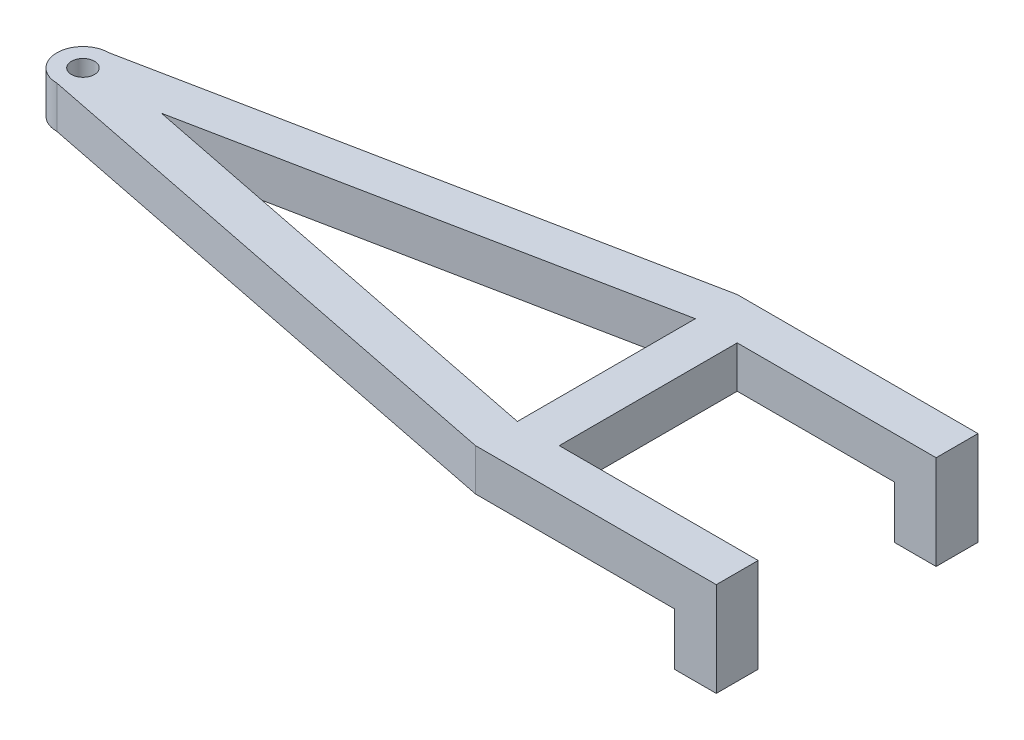
ISO-10303-21;
HEADER;
FILE_DESCRIPTION(('STEP AP214'),'2;1');
FILE_NAME('part.step','',(''),(''),'','','');
FILE_SCHEMA(('AUTOMOTIVE_DESIGN { 1 0 10303 214 1 1 1 1 }'));
ENDSEC;
DATA;
#1=APPLICATION_CONTEXT('core data for automotive mechanical design processes');
#2=APPLICATION_PROTOCOL_DEFINITION('international standard','automotive_design',2000,#1);
#3=PRODUCT_CONTEXT('',#1,'mechanical');
#4=PRODUCT('Part','Part','',(#3));
#5=PRODUCT_RELATED_PRODUCT_CATEGORY('part','',(#4));
#6=PRODUCT_DEFINITION_FORMATION('','',#4);
#7=PRODUCT_DEFINITION_CONTEXT('part definition',#1,'design');
#8=PRODUCT_DEFINITION('design','',#6,#7);
#9=PRODUCT_DEFINITION_SHAPE('','',#8);
#10=(LENGTH_UNIT() NAMED_UNIT(*) SI_UNIT(.MILLI.,.METRE.));
#11=(NAMED_UNIT(*) PLANE_ANGLE_UNIT() SI_UNIT($,.RADIAN.));
#12=(NAMED_UNIT(*) SI_UNIT($,.STERADIAN.) SOLID_ANGLE_UNIT());
#13=UNCERTAINTY_MEASURE_WITH_UNIT(LENGTH_MEASURE(1.E-05),#10,'distance_accuracy_value','');
#14=(GEOMETRIC_REPRESENTATION_CONTEXT(3) GLOBAL_UNCERTAINTY_ASSIGNED_CONTEXT((#13)) GLOBAL_UNIT_ASSIGNED_CONTEXT((#10,
#11,#12)) REPRESENTATION_CONTEXT('',''));
#15=CARTESIAN_POINT('',(0.,0.,0.));
#16=DIRECTION('',(0.,0.,1.));
#17=DIRECTION('',(1.,0.,0.));
#18=AXIS2_PLACEMENT_3D('',#15,#16,#17);
#19=CARTESIAN_POINT('',(0.,0.,0.));
#20=DIRECTION('',(0.,1.,0.));
#21=DIRECTION('',(0.,0.,1.));
#22=AXIS2_PLACEMENT_3D('',#19,#20,#21);
#23=PLANE('',#22);
#24=DIRECTION('',(0.98058067569092,0.,0.196116135138184));
#25=VECTOR('',#24,1.);
#26=CARTESIAN_POINT('',(6.83737044241701,0.,-34.186852212085));
#27=LINE('',#26,#25);
#28=CARTESIAN_POINT('',(-26.7397991567624,0.,-40.9022861319209));
#29=VERTEX_POINT('',#28);
#30=CARTESIAN_POINT('',(15.7602008432377,0.,-32.4022861319209));
#31=VERTEX_POINT('',#30);
#32=EDGE_CURVE('E210',#29,#31,#27,.T.);
#33=ORIENTED_EDGE('',*,*,#32,.T.);
#34=DIRECTION('',(0.,0.,1.));
#35=VECTOR('',#34,1.);
#36=CARTESIAN_POINT('',(15.7602008432377,0.,0.));
#37=LINE('',#36,#35);
#38=CARTESIAN_POINT('',(15.7602008432377,0.,-49.4022861319209));
#39=VERTEX_POINT('',#38);
#40=EDGE_CURVE('E278',#39,#31,#37,.T.);
#41=ORIENTED_EDGE('',*,*,#40,.F.);
#42=DIRECTION('',(0.98058067569092,0.,-0.196116135138184));
#43=VECTOR('',#42,1.);
#44=CARTESIAN_POINT('',(-8.89427806986027,0.,-44.4713903493013));
#45=LINE('',#44,#43);
#46=EDGE_CURVE('E215',#29,#39,#45,.T.);
#47=ORIENTED_EDGE('',*,*,#46,.F.);
#48=EDGE_LOOP('',(#33,#41,#47));
#49=FACE_BOUND('',#48,.T.);
#50=CARTESIAN_POINT('',(-34.2397991567623,0.,-40.9022861319209));
#51=DIRECTION('',(0.,1.,0.));
#52=DIRECTION('',(0.,0.,1.));
#53=AXIS2_PLACEMENT_3D('',#50,#51,#52);
#54=CIRCLE('',#53,1.1);
#55=CARTESIAN_POINT('',(-34.2397991567623,0.,-39.8022861319209));
#56=VERTEX_POINT('',#55);
#57=EDGE_CURVE('E237',#56,#56,#54,.T.);
#58=ORIENTED_EDGE('',*,*,#57,.T.);
#59=EDGE_LOOP('',(#58));
#60=FACE_BOUND('',#59,.T.);
#61=DIRECTION('',(0.,0.,-1.));
#62=VECTOR('',#61,1.);
#63=CARTESIAN_POINT('',(34.7602008432377,0.,-49.4022861319209));
#64=LINE('',#63,#62);
#65=CARTESIAN_POINT('',(34.7602008432377,0.,-49.4022861319209));
#66=VERTEX_POINT('',#65);
#67=CARTESIAN_POINT('',(34.7602008432377,0.,-53.4022861319209));
#68=VERTEX_POINT('',#67);
#69=EDGE_CURVE('E52',#66,#68,#64,.T.);
#70=ORIENTED_EDGE('',*,*,#69,.F.);
#71=DIRECTION('',(1.,0.,0.));
#72=VECTOR('',#71,1.);
#73=CARTESIAN_POINT('',(0.,0.,-49.4022861319209));
#74=LINE('',#73,#72);
#75=CARTESIAN_POINT('',(19.7602008432377,0.,-49.4022861319209));
#76=VERTEX_POINT('',#75);
#77=EDGE_CURVE('E234',#76,#66,#74,.T.);
#78=ORIENTED_EDGE('',*,*,#77,.F.);
#79=DIRECTION('',(0.,0.,1.));
#80=VECTOR('',#79,1.);
#81=CARTESIAN_POINT('',(19.7602008432377,0.,0.));
#82=LINE('',#81,#80);
#83=CARTESIAN_POINT('',(19.7602008432377,0.,-32.4022861319209));
#84=VERTEX_POINT('',#83);
#85=EDGE_CURVE('E231',#76,#84,#82,.T.);
#86=ORIENTED_EDGE('',*,*,#85,.T.);
#87=DIRECTION('',(1.,0.,0.));
#88=VECTOR('',#87,1.);
#89=CARTESIAN_POINT('',(0.,0.,-32.4022861319209));
#90=LINE('',#89,#88);
#91=CARTESIAN_POINT('',(34.7602008432377,0.,-32.4022861319209));
#92=VERTEX_POINT('',#91);
#93=EDGE_CURVE('E222',#84,#92,#90,.T.);
#94=ORIENTED_EDGE('',*,*,#93,.T.);
#95=DIRECTION('',(0.,0.,-1.));
#96=VECTOR('',#95,1.);
#97=CARTESIAN_POINT('',(34.7602008432377,0.,-28.4022861319209));
#98=LINE('',#97,#96);
#99=CARTESIAN_POINT('',(34.7602008432377,0.,-28.4022861319209));
#100=VERTEX_POINT('',#99);
#101=EDGE_CURVE('E177',#100,#92,#98,.T.);
#102=ORIENTED_EDGE('',*,*,#101,.F.);
#103=DIRECTION('',(1.,0.,0.));
#104=VECTOR('',#103,1.);
#105=CARTESIAN_POINT('',(0.,0.,-28.4022861319209));
#106=LINE('',#105,#104);
#107=CARTESIAN_POINT('',(15.7602008432377,0.,-28.4022861319209));
#108=VERTEX_POINT('',#107);
#109=EDGE_CURVE('E218',#108,#100,#106,.T.);
#110=ORIENTED_EDGE('',*,*,#109,.F.);
#111=DIRECTION('',(0.98058067569092,0.,0.196116135138184));
#112=VECTOR('',#111,1.);
#113=CARTESIAN_POINT('',(6.06813967318624,0.,-30.3406983659312));
#114=LINE('',#113,#112);
#115=CARTESIAN_POINT('',(-34.2397991567623,0.,-38.4022861319209));
#116=VERTEX_POINT('',#115);
#117=EDGE_CURVE('E223',#116,#108,#114,.T.);
#118=ORIENTED_EDGE('',*,*,#117,.F.);
#119=CARTESIAN_POINT('',(-34.2397991567623,0.,-40.9022861319209));
#120=DIRECTION('',(0.,1.,0.));
#121=DIRECTION('',(0.,0.,1.));
#122=AXIS2_PLACEMENT_3D('',#119,#120,#121);
#123=CIRCLE('',#122,2.5);
#124=CARTESIAN_POINT('',(-34.2397991567623,0.,-43.4022861319209));
#125=VERTEX_POINT('',#124);
#126=EDGE_CURVE('E286',#125,#116,#123,.T.);
#127=ORIENTED_EDGE('',*,*,#126,.F.);
#128=DIRECTION('',(0.98058067569092,0.,-0.196116135138184));
#129=VECTOR('',#128,1.);
#130=CARTESIAN_POINT('',(-9.66350883909104,0.,-48.3175441954552));
#131=LINE('',#130,#129);
#132=CARTESIAN_POINT('',(15.7602008432377,0.,-53.4022861319209));
#133=VERTEX_POINT('',#132);
#134=EDGE_CURVE('E284',#125,#133,#131,.T.);
#135=ORIENTED_EDGE('',*,*,#134,.T.);
#136=DIRECTION('',(1.,0.,0.));
#137=VECTOR('',#136,1.);
#138=CARTESIAN_POINT('',(0.,0.,-53.402286131921));
#139=LINE('',#138,#137);
#140=EDGE_CURVE('E57',#133,#68,#139,.T.);
#141=ORIENTED_EDGE('',*,*,#140,.T.);
#142=EDGE_LOOP('',(#70,#78,#86,#94,#102,#110,#118,#127,#135,#141));
#143=FACE_BOUND('',#142,.T.);
#144=ADVANCED_FACE('F35',(#49,#60,#143),#23,.F.);
#145=CARTESIAN_POINT('',(-9.66350883909104,4.,-48.3175441954552));
#146=DIRECTION('',(-0.196116135138184,0.,-0.98058067569092));
#147=DIRECTION('',(-0.98058067569092,0.,0.196116135138184));
#148=AXIS2_PLACEMENT_3D('',#145,#146,#147);
#149=PLANE('',#148);
#150=ORIENTED_EDGE('',*,*,#134,.F.);
#151=DIRECTION('',(0.,-1.,0.));
#152=VECTOR('',#151,1.);
#153=CARTESIAN_POINT('',(-34.2397991567623,4.,-43.4022861319209));
#154=LINE('',#153,#152);
#155=CARTESIAN_POINT('',(-34.2397991567623,4.,-43.4022861319209));
#156=VERTEX_POINT('',#155);
#157=EDGE_CURVE('E11',#156,#125,#154,.T.);
#158=ORIENTED_EDGE('',*,*,#157,.F.);
#159=DIRECTION('',(0.98058067569092,0.,-0.196116135138184));
#160=VECTOR('',#159,1.);
#161=CARTESIAN_POINT('',(-9.66350883909104,4.,-48.3175441954552));
#162=LINE('',#161,#160);
#163=CARTESIAN_POINT('',(15.7602008432377,4.,-53.4022861319209));
#164=VERTEX_POINT('',#163);
#165=EDGE_CURVE('E316',#156,#164,#162,.T.);
#166=ORIENTED_EDGE('',*,*,#165,.T.);
#167=DIRECTION('',(0.,-1.,0.));
#168=VECTOR('',#167,1.);
#169=CARTESIAN_POINT('',(15.7602008432377,4.,-53.4022861319209));
#170=LINE('',#169,#168);
#171=EDGE_CURVE('E240',#164,#133,#170,.T.);
#172=ORIENTED_EDGE('',*,*,#171,.T.);
#173=EDGE_LOOP('',(#150,#158,#166,#172));
#174=FACE_BOUND('',#173,.T.);
#175=ADVANCED_FACE('F352',(#174),#149,.T.);
#176=CARTESIAN_POINT('',(-34.2397991567623,4.,-40.9022861319209));
#177=DIRECTION('',(0.,-1.,0.));
#178=DIRECTION('',(0.,0.,-1.));
#179=AXIS2_PLACEMENT_3D('',#176,#177,#178);
#180=CYLINDRICAL_SURFACE('',#179,2.5);
#181=ORIENTED_EDGE('',*,*,#126,.T.);
#182=DIRECTION('',(0.,-1.,0.));
#183=VECTOR('',#182,1.);
#184=CARTESIAN_POINT('',(-34.2397991567623,4.,-38.4022861319209));
#185=LINE('',#184,#183);
#186=CARTESIAN_POINT('',(-34.2397991567623,4.,-38.4022861319209));
#187=VERTEX_POINT('',#186);
#188=EDGE_CURVE('E44',#187,#116,#185,.T.);
#189=ORIENTED_EDGE('',*,*,#188,.F.);
#190=CARTESIAN_POINT('',(-34.2397991567623,4.,-40.9022861319209));
#191=DIRECTION('',(0.,1.,0.));
#192=DIRECTION('',(0.,0.,1.));
#193=AXIS2_PLACEMENT_3D('',#190,#191,#192);
#194=CIRCLE('',#193,2.5);
#195=EDGE_CURVE('E314',#156,#187,#194,.T.);
#196=ORIENTED_EDGE('',*,*,#195,.F.);
#197=ORIENTED_EDGE('',*,*,#157,.T.);
#198=EDGE_LOOP('',(#181,#189,#196,#197));
#199=FACE_BOUND('',#198,.T.);
#200=ADVANCED_FACE('F356',(#199),#180,.T.);
#201=CARTESIAN_POINT('',(6.06813967318624,4.,-30.3406983659312));
#202=DIRECTION('',(0.196116135138184,0.,-0.98058067569092));
#203=DIRECTION('',(-0.98058067569092,0.,-0.196116135138184));
#204=AXIS2_PLACEMENT_3D('',#201,#202,#203);
#205=PLANE('',#204);
#206=ORIENTED_EDGE('',*,*,#117,.T.);
#207=DIRECTION('',(0.,-1.,0.));
#208=VECTOR('',#207,1.);
#209=CARTESIAN_POINT('',(15.7602008432377,4.,-28.4022861319209));
#210=LINE('',#209,#208);
#211=CARTESIAN_POINT('',(15.7602008432377,4.,-28.4022861319209));
#212=VERTEX_POINT('',#211);
#213=EDGE_CURVE('E254',#212,#108,#210,.T.);
#214=ORIENTED_EDGE('',*,*,#213,.F.);
#215=DIRECTION('',(0.98058067569092,0.,0.196116135138184));
#216=VECTOR('',#215,1.);
#217=CARTESIAN_POINT('',(6.06813967318624,4.,-30.3406983659312));
#218=LINE('',#217,#216);
#219=EDGE_CURVE('E307',#187,#212,#218,.T.);
#220=ORIENTED_EDGE('',*,*,#219,.F.);
#221=ORIENTED_EDGE('',*,*,#188,.T.);
#222=EDGE_LOOP('',(#206,#214,#220,#221));
#223=FACE_BOUND('',#222,.T.);
#224=ADVANCED_FACE('F295',(#223),#205,.F.);
#225=CARTESIAN_POINT('',(0.,4.,-28.4022861319209));
#226=DIRECTION('',(0.,0.,-1.));
#227=DIRECTION('',(-1.,0.,0.));
#228=AXIS2_PLACEMENT_3D('',#225,#226,#227);
#229=PLANE('',#228);
#230=ORIENTED_EDGE('',*,*,#109,.T.);
#231=DIRECTION('',(0.,1.,0.));
#232=VECTOR('',#231,1.);
#233=CARTESIAN_POINT('',(34.7602008432377,-5.,-28.4022861319209));
#234=LINE('',#233,#232);
#235=CARTESIAN_POINT('',(34.7602008432377,-5.,-28.4022861319209));
#236=VERTEX_POINT('',#235);
#237=EDGE_CURVE('E196',#236,#100,#234,.T.);
#238=ORIENTED_EDGE('',*,*,#237,.F.);
#239=DIRECTION('',(-1.,0.,0.));
#240=VECTOR('',#239,1.);
#241=CARTESIAN_POINT('',(34.7602008432377,-5.,-28.4022861319209));
#242=LINE('',#241,#240);
#243=CARTESIAN_POINT('',(38.7602008432377,-5.,-28.4022861319209));
#244=VERTEX_POINT('',#243);
#245=EDGE_CURVE('E194',#244,#236,#242,.T.);
#246=ORIENTED_EDGE('',*,*,#245,.F.);
#247=DIRECTION('',(0.,-1.,0.));
#248=VECTOR('',#247,1.);
#249=CARTESIAN_POINT('',(38.7602008432377,4.,-28.4022861319209));
#250=LINE('',#249,#248);
#251=CARTESIAN_POINT('',(38.7602008432377,4.,-28.4022861319209));
#252=VERTEX_POINT('',#251);
#253=EDGE_CURVE('E252',#252,#244,#250,.T.);
#254=ORIENTED_EDGE('',*,*,#253,.F.);
#255=DIRECTION('',(1.,0.,0.));
#256=VECTOR('',#255,1.);
#257=CARTESIAN_POINT('',(0.,4.,-28.4022861319209));
#258=LINE('',#257,#256);
#259=EDGE_CURVE('E300',#212,#252,#258,.T.);
#260=ORIENTED_EDGE('',*,*,#259,.F.);
#261=ORIENTED_EDGE('',*,*,#213,.T.);
#262=EDGE_LOOP('',(#230,#238,#246,#254,#260,#261));
#263=FACE_BOUND('',#262,.T.);
#264=ADVANCED_FACE('F298',(#263),#229,.F.);
#265=CARTESIAN_POINT('',(38.7602008432376,4.,0.));
#266=DIRECTION('',(1.,0.,0.));
#267=DIRECTION('',(0.,0.,-1.));
#268=AXIS2_PLACEMENT_3D('',#265,#266,#267);
#269=PLANE('',#268);
#270=ORIENTED_EDGE('',*,*,#253,.T.);
#271=DIRECTION('',(0.,0.,1.));
#272=VECTOR('',#271,1.);
#273=CARTESIAN_POINT('',(38.7602008432377,-5.,-28.4022861319209));
#274=LINE('',#273,#272);
#275=CARTESIAN_POINT('',(38.7602008432377,-5.,-32.4022861319209));
#276=VERTEX_POINT('',#275);
#277=EDGE_CURVE('E191',#276,#244,#274,.T.);
#278=ORIENTED_EDGE('',*,*,#277,.F.);
#279=DIRECTION('',(0.,-1.,0.));
#280=VECTOR('',#279,1.);
#281=CARTESIAN_POINT('',(38.7602008432377,4.,-32.4022861319209));
#282=LINE('',#281,#280);
#283=CARTESIAN_POINT('',(38.7602008432377,4.,-32.4022861319209));
#284=VERTEX_POINT('',#283);
#285=EDGE_CURVE('E250',#284,#276,#282,.T.);
#286=ORIENTED_EDGE('',*,*,#285,.F.);
#287=DIRECTION('',(0.,0.,1.));
#288=VECTOR('',#287,1.);
#289=CARTESIAN_POINT('',(38.7602008432376,4.,0.));
#290=LINE('',#289,#288);
#291=EDGE_CURVE('E306',#284,#252,#290,.T.);
#292=ORIENTED_EDGE('',*,*,#291,.T.);
#293=EDGE_LOOP('',(#270,#278,#286,#292));
#294=FACE_BOUND('',#293,.T.);
#295=ADVANCED_FACE('F377',(#294),#269,.T.);
#296=CARTESIAN_POINT('',(0.,4.,-32.4022861319209));
#297=DIRECTION('',(0.,0.,-1.));
#298=DIRECTION('',(-1.,0.,0.));
#299=AXIS2_PLACEMENT_3D('',#296,#297,#298);
#300=PLANE('',#299);
#301=ORIENTED_EDGE('',*,*,#93,.F.);
#302=DIRECTION('',(0.,-1.,0.));
#303=VECTOR('',#302,1.);
#304=CARTESIAN_POINT('',(19.7602008432377,4.,-32.4022861319209));
#305=LINE('',#304,#303);
#306=CARTESIAN_POINT('',(19.7602008432377,4.,-32.4022861319209));
#307=VERTEX_POINT('',#306);
#308=EDGE_CURVE('E248',#307,#84,#305,.T.);
#309=ORIENTED_EDGE('',*,*,#308,.F.);
#310=DIRECTION('',(1.,0.,0.));
#311=VECTOR('',#310,1.);
#312=CARTESIAN_POINT('',(0.,4.,-32.4022861319209));
#313=LINE('',#312,#311);
#314=EDGE_CURVE('E321',#307,#284,#313,.T.);
#315=ORIENTED_EDGE('',*,*,#314,.T.);
#316=ORIENTED_EDGE('',*,*,#285,.T.);
#317=DIRECTION('',(1.,0.,0.));
#318=VECTOR('',#317,1.);
#319=CARTESIAN_POINT('',(34.7602008432377,-5.,-32.4022861319209));
#320=LINE('',#319,#318);
#321=CARTESIAN_POINT('',(34.7602008432377,-5.,-32.4022861319209));
#322=VERTEX_POINT('',#321);
#323=EDGE_CURVE('E188',#322,#276,#320,.T.);
#324=ORIENTED_EDGE('',*,*,#323,.F.);
#325=DIRECTION('',(0.,1.,0.));
#326=VECTOR('',#325,1.);
#327=CARTESIAN_POINT('',(34.7602008432377,-5.,-32.4022861319209));
#328=LINE('',#327,#326);
#329=EDGE_CURVE('E205',#322,#92,#328,.T.);
#330=ORIENTED_EDGE('',*,*,#329,.T.);
#331=EDGE_LOOP('',(#301,#309,#315,#316,#324,#330));
#332=FACE_BOUND('',#331,.T.);
#333=ADVANCED_FACE('F373',(#332),#300,.T.);
#334=CARTESIAN_POINT('',(19.7602008432377,4.,0.));
#335=DIRECTION('',(1.,0.,0.));
#336=DIRECTION('',(0.,0.,-1.));
#337=AXIS2_PLACEMENT_3D('',#334,#335,#336);
#338=PLANE('',#337);
#339=ORIENTED_EDGE('',*,*,#85,.F.);
#340=DIRECTION('',(0.,-1.,0.));
#341=VECTOR('',#340,1.);
#342=CARTESIAN_POINT('',(19.7602008432377,4.,-49.4022861319209));
#343=LINE('',#342,#341);
#344=CARTESIAN_POINT('',(19.7602008432377,4.,-49.4022861319209));
#345=VERTEX_POINT('',#344);
#346=EDGE_CURVE('E246',#345,#76,#343,.T.);
#347=ORIENTED_EDGE('',*,*,#346,.F.);
#348=DIRECTION('',(0.,0.,1.));
#349=VECTOR('',#348,1.);
#350=CARTESIAN_POINT('',(19.7602008432377,4.,0.));
#351=LINE('',#350,#349);
#352=EDGE_CURVE('E324',#345,#307,#351,.T.);
#353=ORIENTED_EDGE('',*,*,#352,.T.);
#354=ORIENTED_EDGE('',*,*,#308,.T.);
#355=EDGE_LOOP('',(#339,#347,#353,#354));
#356=FACE_BOUND('',#355,.T.);
#357=ADVANCED_FACE('F369',(#356),#338,.T.);
#358=CARTESIAN_POINT('',(0.,4.,-49.4022861319209));
#359=DIRECTION('',(0.,0.,-1.));
#360=DIRECTION('',(-1.,0.,0.));
#361=AXIS2_PLACEMENT_3D('',#358,#359,#360);
#362=PLANE('',#361);
#363=ORIENTED_EDGE('',*,*,#77,.T.);
#364=DIRECTION('',(0.,1.,0.));
#365=VECTOR('',#364,1.);
#366=CARTESIAN_POINT('',(34.7602008432377,-5.,-49.4022861319209));
#367=LINE('',#366,#365);
#368=CARTESIAN_POINT('',(34.7602008432377,-5.,-49.4022861319209));
#369=VERTEX_POINT('',#368);
#370=EDGE_CURVE('E178',#369,#66,#367,.T.);
#371=ORIENTED_EDGE('',*,*,#370,.F.);
#372=DIRECTION('',(-1.,0.,0.));
#373=VECTOR('',#372,1.);
#374=CARTESIAN_POINT('',(34.7602008432377,-5.,-49.4022861319209));
#375=LINE('',#374,#373);
#376=CARTESIAN_POINT('',(38.7602008432377,-5.,-49.4022861319209));
#377=VERTEX_POINT('',#376);
#378=EDGE_CURVE('E171',#377,#369,#375,.T.);
#379=ORIENTED_EDGE('',*,*,#378,.F.);
#380=DIRECTION('',(0.,-1.,0.));
#381=VECTOR('',#380,1.);
#382=CARTESIAN_POINT('',(38.7602008432377,4.,-49.4022861319209));
#383=LINE('',#382,#381);
#384=CARTESIAN_POINT('',(38.7602008432377,4.,-49.4022861319209));
#385=VERTEX_POINT('',#384);
#386=EDGE_CURVE('E244',#385,#377,#383,.T.);
#387=ORIENTED_EDGE('',*,*,#386,.F.);
#388=DIRECTION('',(1.,0.,0.));
#389=VECTOR('',#388,1.);
#390=CARTESIAN_POINT('',(0.,4.,-49.4022861319209));
#391=LINE('',#390,#389);
#392=EDGE_CURVE('E327',#345,#385,#391,.T.);
#393=ORIENTED_EDGE('',*,*,#392,.F.);
#394=ORIENTED_EDGE('',*,*,#346,.T.);
#395=EDGE_LOOP('',(#363,#371,#379,#387,#393,#394));
#396=FACE_BOUND('',#395,.T.);
#397=ADVANCED_FACE('F365',(#396),#362,.F.);
#398=CARTESIAN_POINT('',(38.7602008432376,4.,0.));
#399=DIRECTION('',(1.,0.,0.));
#400=DIRECTION('',(0.,0.,-1.));
#401=AXIS2_PLACEMENT_3D('',#398,#399,#400);
#402=PLANE('',#401);
#403=ORIENTED_EDGE('',*,*,#386,.T.);
#404=DIRECTION('',(0.,0.,1.));
#405=VECTOR('',#404,1.);
#406=CARTESIAN_POINT('',(38.7602008432377,-5.,-49.4022861319209));
#407=LINE('',#406,#405);
#408=CARTESIAN_POINT('',(38.7602008432377,-5.,-53.4022861319209));
#409=VERTEX_POINT('',#408);
#410=EDGE_CURVE('E165',#409,#377,#407,.T.);
#411=ORIENTED_EDGE('',*,*,#410,.F.);
#412=DIRECTION('',(0.,-1.,0.));
#413=VECTOR('',#412,1.);
#414=CARTESIAN_POINT('',(38.7602008432377,4.,-53.4022861319209));
#415=LINE('',#414,#413);
#416=CARTESIAN_POINT('',(38.7602008432377,4.,-53.4022861319209));
#417=VERTEX_POINT('',#416);
#418=EDGE_CURVE('E161',#417,#409,#415,.T.);
#419=ORIENTED_EDGE('',*,*,#418,.F.);
#420=DIRECTION('',(0.,0.,1.));
#421=VECTOR('',#420,1.);
#422=CARTESIAN_POINT('',(38.7602008432376,4.,0.));
#423=LINE('',#422,#421);
#424=EDGE_CURVE('E329',#417,#385,#423,.T.);
#425=ORIENTED_EDGE('',*,*,#424,.T.);
#426=EDGE_LOOP('',(#403,#411,#419,#425));
#427=FACE_BOUND('',#426,.T.);
#428=ADVANCED_FACE('F362',(#427),#402,.T.);
#429=CARTESIAN_POINT('',(6.83737044241701,4.,-34.186852212085));
#430=DIRECTION('',(0.196116135138184,0.,-0.98058067569092));
#431=DIRECTION('',(-0.98058067569092,0.,-0.196116135138184));
#432=AXIS2_PLACEMENT_3D('',#429,#430,#431);
#433=PLANE('',#432);
#434=ORIENTED_EDGE('',*,*,#32,.F.);
#435=DIRECTION('',(0.,-1.,0.));
#436=VECTOR('',#435,1.);
#437=CARTESIAN_POINT('',(-26.7397991567624,4.,-40.9022861319209));
#438=LINE('',#437,#436);
#439=CARTESIAN_POINT('',(-26.7397991567624,4.,-40.9022861319209));
#440=VERTEX_POINT('',#439);
#441=EDGE_CURVE('E242',#440,#29,#438,.T.);
#442=ORIENTED_EDGE('',*,*,#441,.F.);
#443=DIRECTION('',(0.98058067569092,0.,0.196116135138184));
#444=VECTOR('',#443,1.);
#445=CARTESIAN_POINT('',(6.83737044241701,4.,-34.186852212085));
#446=LINE('',#445,#444);
#447=CARTESIAN_POINT('',(15.7602008432377,4.,-32.4022861319209));
#448=VERTEX_POINT('',#447);
#449=EDGE_CURVE('E199',#440,#448,#446,.T.);
#450=ORIENTED_EDGE('',*,*,#449,.T.);
#451=DIRECTION('',(0.,-1.,0.));
#452=VECTOR('',#451,1.);
#453=CARTESIAN_POINT('',(15.7602008432377,4.,-32.4022861319209));
#454=LINE('',#453,#452);
#455=EDGE_CURVE('E259',#448,#31,#454,.T.);
#456=ORIENTED_EDGE('',*,*,#455,.T.);
#457=EDGE_LOOP('',(#434,#442,#450,#456));
#458=FACE_BOUND('',#457,.T.);
#459=ADVANCED_FACE('F37',(#458),#433,.T.);
#460=CARTESIAN_POINT('',(-8.89427806986027,4.,-44.4713903493013));
#461=DIRECTION('',(-0.196116135138184,0.,-0.98058067569092));
#462=DIRECTION('',(-0.98058067569092,0.,0.196116135138184));
#463=AXIS2_PLACEMENT_3D('',#460,#461,#462);
#464=PLANE('',#463);
#465=ORIENTED_EDGE('',*,*,#46,.T.);
#466=DIRECTION('',(0.,-1.,0.));
#467=VECTOR('',#466,1.);
#468=CARTESIAN_POINT('',(15.7602008432377,4.,-49.4022861319209));
#469=LINE('',#468,#467);
#470=CARTESIAN_POINT('',(15.7602008432377,4.,-49.4022861319209));
#471=VERTEX_POINT('',#470);
#472=EDGE_CURVE('E261',#471,#39,#469,.T.);
#473=ORIENTED_EDGE('',*,*,#472,.F.);
#474=DIRECTION('',(0.98058067569092,0.,-0.196116135138184));
#475=VECTOR('',#474,1.);
#476=CARTESIAN_POINT('',(-8.89427806986027,4.,-44.4713903493013));
#477=LINE('',#476,#475);
#478=EDGE_CURVE('E269',#440,#471,#477,.T.);
#479=ORIENTED_EDGE('',*,*,#478,.F.);
#480=ORIENTED_EDGE('',*,*,#441,.T.);
#481=EDGE_LOOP('',(#465,#473,#479,#480));
#482=FACE_BOUND('',#481,.T.);
#483=ADVANCED_FACE('F267',(#482),#464,.F.);
#484=CARTESIAN_POINT('',(0.,4.,-53.402286131921));
#485=DIRECTION('',(0.,0.,-1.));
#486=DIRECTION('',(-1.,0.,0.));
#487=AXIS2_PLACEMENT_3D('',#484,#485,#486);
#488=PLANE('',#487);
#489=ORIENTED_EDGE('',*,*,#140,.F.);
#490=ORIENTED_EDGE('',*,*,#171,.F.);
#491=DIRECTION('',(1.,0.,0.));
#492=VECTOR('',#491,1.);
#493=CARTESIAN_POINT('',(0.,4.,-53.402286131921));
#494=LINE('',#493,#492);
#495=EDGE_CURVE('E332',#164,#417,#494,.T.);
#496=ORIENTED_EDGE('',*,*,#495,.T.);
#497=ORIENTED_EDGE('',*,*,#418,.T.);
#498=DIRECTION('',(1.,0.,0.));
#499=VECTOR('',#498,1.);
#500=CARTESIAN_POINT('',(34.7602008432377,-5.,-53.4022861319209));
#501=LINE('',#500,#499);
#502=CARTESIAN_POINT('',(34.7602008432377,-5.,-53.4022861319209));
#503=VERTEX_POINT('',#502);
#504=EDGE_CURVE('E155',#503,#409,#501,.T.);
#505=ORIENTED_EDGE('',*,*,#504,.F.);
#506=DIRECTION('',(0.,1.,0.));
#507=VECTOR('',#506,1.);
#508=CARTESIAN_POINT('',(34.7602008432377,-5.,-53.4022861319209));
#509=LINE('',#508,#507);
#510=EDGE_CURVE('E159',#503,#68,#509,.T.);
#511=ORIENTED_EDGE('',*,*,#510,.T.);
#512=EDGE_LOOP('',(#489,#490,#496,#497,#505,#511));
#513=FACE_BOUND('',#512,.T.);
#514=ADVANCED_FACE('F157',(#513),#488,.T.);
#515=CARTESIAN_POINT('',(15.7602008432377,4.,0.));
#516=DIRECTION('',(1.,0.,0.));
#517=DIRECTION('',(0.,0.,-1.));
#518=AXIS2_PLACEMENT_3D('',#515,#516,#517);
#519=PLANE('',#518);
#520=ORIENTED_EDGE('',*,*,#40,.T.);
#521=ORIENTED_EDGE('',*,*,#455,.F.);
#522=DIRECTION('',(0.,0.,1.));
#523=VECTOR('',#522,1.);
#524=CARTESIAN_POINT('',(15.7602008432377,4.,0.));
#525=LINE('',#524,#523);
#526=EDGE_CURVE('E578',#471,#448,#525,.T.);
#527=ORIENTED_EDGE('',*,*,#526,.F.);
#528=ORIENTED_EDGE('',*,*,#472,.T.);
#529=EDGE_LOOP('',(#520,#521,#527,#528));
#530=FACE_BOUND('',#529,.T.);
#531=ADVANCED_FACE('F283',(#530),#519,.F.);
#532=CARTESIAN_POINT('',(-34.2397991567623,4.,-40.9022861319209));
#533=DIRECTION('',(0.,-1.,0.));
#534=DIRECTION('',(0.,0.,-1.));
#535=AXIS2_PLACEMENT_3D('',#532,#533,#534);
#536=CYLINDRICAL_SURFACE('',#535,1.1);
#537=CARTESIAN_POINT('',(-34.2397991567623,4.,-40.9022861319209));
#538=DIRECTION('',(0.,1.,0.));
#539=DIRECTION('',(0.,0.,1.));
#540=AXIS2_PLACEMENT_3D('',#537,#538,#539);
#541=CIRCLE('',#540,1.1);
#542=CARTESIAN_POINT('',(-34.2397991567623,4.,-39.8022861319209));
#543=VERTEX_POINT('',#542);
#544=EDGE_CURVE('E262',#543,#543,#541,.T.);
#545=ORIENTED_EDGE('',*,*,#544,.T.);
#546=EDGE_LOOP('',(#545));
#547=FACE_BOUND('',#546,.T.);
#548=ORIENTED_EDGE('',*,*,#57,.F.);
#549=EDGE_LOOP('',(#548));
#550=FACE_BOUND('',#549,.T.);
#551=ADVANCED_FACE('F337',(#547,#550),#536,.F.);
#552=CARTESIAN_POINT('',(0.,4.,0.));
#553=DIRECTION('',(0.,1.,0.));
#554=DIRECTION('',(0.,0.,1.));
#555=AXIS2_PLACEMENT_3D('',#552,#553,#554);
#556=PLANE('',#555);
#557=ORIENTED_EDGE('',*,*,#449,.F.);
#558=ORIENTED_EDGE('',*,*,#478,.T.);
#559=ORIENTED_EDGE('',*,*,#526,.T.);
#560=EDGE_LOOP('',(#557,#558,#559));
#561=FACE_BOUND('',#560,.T.);
#562=ORIENTED_EDGE('',*,*,#165,.F.);
#563=ORIENTED_EDGE('',*,*,#195,.T.);
#564=ORIENTED_EDGE('',*,*,#219,.T.);
#565=ORIENTED_EDGE('',*,*,#259,.T.);
#566=ORIENTED_EDGE('',*,*,#291,.F.);
#567=ORIENTED_EDGE('',*,*,#314,.F.);
#568=ORIENTED_EDGE('',*,*,#352,.F.);
#569=ORIENTED_EDGE('',*,*,#392,.T.);
#570=ORIENTED_EDGE('',*,*,#424,.F.);
#571=ORIENTED_EDGE('',*,*,#495,.F.);
#572=EDGE_LOOP('',(#562,#563,#564,#565,#566,#567,#568,#569,#570,#571));
#573=FACE_BOUND('',#572,.T.);
#574=ORIENTED_EDGE('',*,*,#544,.F.);
#575=EDGE_LOOP('',(#574));
#576=FACE_BOUND('',#575,.T.);
#577=ADVANCED_FACE('F311',(#561,#573,#576),#556,.T.);
#578=CARTESIAN_POINT('',(34.7602008432377,-5.,-28.4022861319209));
#579=DIRECTION('',(1.,0.,0.));
#580=DIRECTION('',(0.,0.,-1.));
#581=AXIS2_PLACEMENT_3D('',#578,#579,#580);
#582=PLANE('',#581);
#583=ORIENTED_EDGE('',*,*,#101,.T.);
#584=ORIENTED_EDGE('',*,*,#329,.F.);
#585=DIRECTION('',(0.,0.,-1.));
#586=VECTOR('',#585,1.);
#587=CARTESIAN_POINT('',(34.7602008432377,-5.,-28.4022861319209));
#588=LINE('',#587,#586);
#589=EDGE_CURVE('E181',#236,#322,#588,.T.);
#590=ORIENTED_EDGE('',*,*,#589,.F.);
#591=ORIENTED_EDGE('',*,*,#237,.T.);
#592=EDGE_LOOP('',(#583,#584,#590,#591));
#593=FACE_BOUND('',#592,.T.);
#594=ADVANCED_FACE('F340',(#593),#582,.F.);
#595=CARTESIAN_POINT('',(0.,-5.,0.));
#596=DIRECTION('',(0.,-1.,0.));
#597=DIRECTION('',(0.,0.,-1.));
#598=AXIS2_PLACEMENT_3D('',#595,#596,#597);
#599=PLANE('',#598);
#600=ORIENTED_EDGE('',*,*,#589,.T.);
#601=ORIENTED_EDGE('',*,*,#323,.T.);
#602=ORIENTED_EDGE('',*,*,#277,.T.);
#603=ORIENTED_EDGE('',*,*,#245,.T.);
#604=EDGE_LOOP('',(#600,#601,#602,#603));
#605=FACE_BOUND('',#604,.T.);
#606=ADVANCED_FACE('F347',(#605),#599,.T.);
#607=CARTESIAN_POINT('',(34.7602008432377,-5.,-49.4022861319209));
#608=DIRECTION('',(1.,0.,0.));
#609=DIRECTION('',(0.,0.,-1.));
#610=AXIS2_PLACEMENT_3D('',#607,#608,#609);
#611=PLANE('',#610);
#612=ORIENTED_EDGE('',*,*,#69,.T.);
#613=ORIENTED_EDGE('',*,*,#510,.F.);
#614=DIRECTION('',(0.,0.,-1.));
#615=VECTOR('',#614,1.);
#616=CARTESIAN_POINT('',(34.7602008432377,-5.,-49.4022861319209));
#617=LINE('',#616,#615);
#618=EDGE_CURVE('E166',#369,#503,#617,.T.);
#619=ORIENTED_EDGE('',*,*,#618,.F.);
#620=ORIENTED_EDGE('',*,*,#370,.T.);
#621=EDGE_LOOP('',(#612,#613,#619,#620));
#622=FACE_BOUND('',#621,.T.);
#623=ADVANCED_FACE('F176',(#622),#611,.F.);
#624=CARTESIAN_POINT('',(0.,-5.,0.));
#625=DIRECTION('',(0.,-1.,0.));
#626=DIRECTION('',(0.,0.,-1.));
#627=AXIS2_PLACEMENT_3D('',#624,#625,#626);
#628=PLANE('',#627);
#629=ORIENTED_EDGE('',*,*,#618,.T.);
#630=ORIENTED_EDGE('',*,*,#504,.T.);
#631=ORIENTED_EDGE('',*,*,#410,.T.);
#632=ORIENTED_EDGE('',*,*,#378,.T.);
#633=EDGE_LOOP('',(#629,#630,#631,#632));
#634=FACE_BOUND('',#633,.T.);
#635=ADVANCED_FACE('F169',(#634),#628,.T.);
#636=CLOSED_SHELL('',(#144,#175,#200,#224,#264,#295,#333,#357,#397,#428,#459,#483,#514,#531,
#551,#577,#594,#606,#623,#635));
#637=MANIFOLD_SOLID_BREP('B2',#636);
#638=ADVANCED_BREP_SHAPE_REPRESENTATION('',(#18,#637),#14);
#639=SHAPE_DEFINITION_REPRESENTATION(#9,#638);
ENDSEC;
END-ISO-10303-21;
